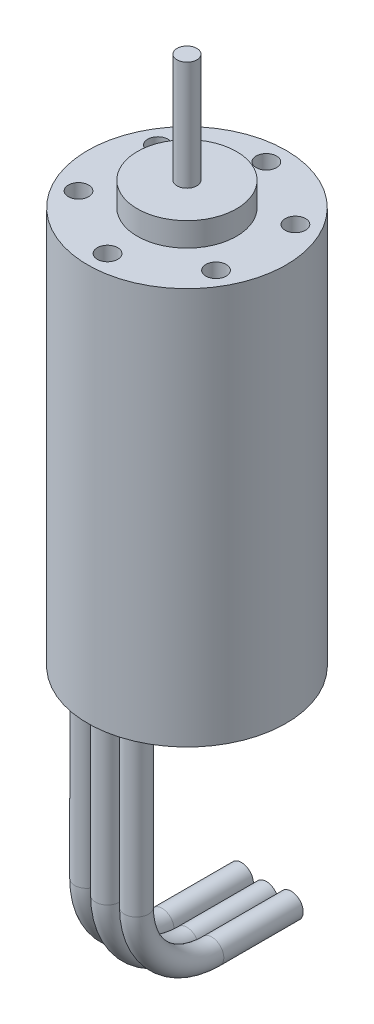
ISO-10303-21;
HEADER;
FILE_DESCRIPTION(('STEP AP214'),'2;1');
FILE_NAME('part.step','',(''),(''),'','','');
FILE_SCHEMA(('AUTOMOTIVE_DESIGN { 1 0 10303 214 1 1 1 1 }'));
ENDSEC;
DATA;
#1=APPLICATION_CONTEXT('core data for automotive mechanical design processes');
#2=APPLICATION_PROTOCOL_DEFINITION('international standard','automotive_design',2000,#1);
#3=PRODUCT_CONTEXT('',#1,'mechanical');
#4=PRODUCT('Part','Part','',(#3));
#5=PRODUCT_RELATED_PRODUCT_CATEGORY('part','',(#4));
#6=PRODUCT_DEFINITION_FORMATION('','',#4);
#7=PRODUCT_DEFINITION_CONTEXT('part definition',#1,'design');
#8=PRODUCT_DEFINITION('design','',#6,#7);
#9=PRODUCT_DEFINITION_SHAPE('','',#8);
#10=(LENGTH_UNIT() NAMED_UNIT(*) SI_UNIT(.MILLI.,.METRE.));
#11=(NAMED_UNIT(*) PLANE_ANGLE_UNIT() SI_UNIT($,.RADIAN.));
#12=(NAMED_UNIT(*) SI_UNIT($,.STERADIAN.) SOLID_ANGLE_UNIT());
#13=UNCERTAINTY_MEASURE_WITH_UNIT(LENGTH_MEASURE(1.E-05),#10,'distance_accuracy_value','');
#14=(GEOMETRIC_REPRESENTATION_CONTEXT(3) GLOBAL_UNCERTAINTY_ASSIGNED_CONTEXT((#13)) GLOBAL_UNIT_ASSIGNED_CONTEXT((#10,
#11,#12)) REPRESENTATION_CONTEXT('',''));
#15=CARTESIAN_POINT('',(0.,0.,0.));
#16=DIRECTION('',(0.,0.,1.));
#17=DIRECTION('',(1.,0.,0.));
#18=AXIS2_PLACEMENT_3D('',#15,#16,#17);
#19=CARTESIAN_POINT('',(0.,55.8,0.));
#20=DIRECTION('',(0.,1.,0.));
#21=DIRECTION('',(0.,0.,1.));
#22=AXIS2_PLACEMENT_3D('',#19,#20,#21);
#23=PLANE('',#22);
#24=CARTESIAN_POINT('',(0.,55.8,0.));
#25=DIRECTION('',(0.,-1.,0.));
#26=DIRECTION('',(0.,0.,-1.));
#27=AXIS2_PLACEMENT_3D('',#24,#25,#26);
#28=CIRCLE('',#27,1.);
#29=CARTESIAN_POINT('',(0.,55.8,-1.));
#30=VERTEX_POINT('',#29);
#31=EDGE_CURVE('E39',#30,#30,#28,.T.);
#32=ORIENTED_EDGE('',*,*,#31,.F.);
#33=EDGE_LOOP('',(#32));
#34=FACE_BOUND('',#33,.T.);
#35=ADVANCED_FACE('F36',(#34),#23,.T.);
#36=CARTESIAN_POINT('',(0.,0.,0.));
#37=DIRECTION('',(0.,-1.,0.));
#38=DIRECTION('',(0.,0.,-1.));
#39=AXIS2_PLACEMENT_3D('',#36,#37,#38);
#40=CYLINDRICAL_SURFACE('',#39,1.);
#41=ORIENTED_EDGE('',*,*,#31,.T.);
#42=EDGE_LOOP('',(#41));
#43=FACE_BOUND('',#42,.T.);
#44=CARTESIAN_POINT('',(0.,44.8,0.));
#45=DIRECTION('',(0.,-1.,0.));
#46=DIRECTION('',(0.,0.,-1.));
#47=AXIS2_PLACEMENT_3D('',#44,#45,#46);
#48=CIRCLE('',#47,1.);
#49=CARTESIAN_POINT('',(0.,44.8,-1.));
#50=VERTEX_POINT('',#49);
#51=EDGE_CURVE('E128',#50,#50,#48,.T.);
#52=ORIENTED_EDGE('',*,*,#51,.F.);
#53=EDGE_LOOP('',(#52));
#54=FACE_BOUND('',#53,.T.);
#55=ADVANCED_FACE('F167',(#43,#54),#40,.T.);
#56=CARTESIAN_POINT('',(1.,44.8,0.));
#57=DIRECTION('',(0.,1.,0.));
#58=DIRECTION('',(0.,0.,1.));
#59=AXIS2_PLACEMENT_3D('',#56,#57,#58);
#60=PLANE('',#59);
#61=ORIENTED_EDGE('',*,*,#51,.T.);
#62=EDGE_LOOP('',(#61));
#63=FACE_BOUND('',#62,.T.);
#64=CARTESIAN_POINT('',(0.,44.8,0.));
#65=DIRECTION('',(0.,-1.,0.));
#66=DIRECTION('',(0.,0.,-1.));
#67=AXIS2_PLACEMENT_3D('',#64,#65,#66);
#68=CIRCLE('',#67,4.99999999999999);
#69=CARTESIAN_POINT('',(0.,44.8,-4.99999999999999));
#70=VERTEX_POINT('',#69);
#71=EDGE_CURVE('E126',#70,#70,#68,.T.);
#72=ORIENTED_EDGE('',*,*,#71,.F.);
#73=EDGE_LOOP('',(#72));
#74=FACE_BOUND('',#73,.T.);
#75=ADVANCED_FACE('F172',(#63,#74),#60,.T.);
#76=CARTESIAN_POINT('',(0.,0.,0.));
#77=DIRECTION('',(0.,-1.,0.));
#78=DIRECTION('',(0.,0.,-1.));
#79=AXIS2_PLACEMENT_3D('',#76,#77,#78);
#80=CYLINDRICAL_SURFACE('',#79,4.99999999999999);
#81=ORIENTED_EDGE('',*,*,#71,.T.);
#82=EDGE_LOOP('',(#81));
#83=FACE_BOUND('',#82,.T.);
#84=CARTESIAN_POINT('',(0.,42.4,0.));
#85=DIRECTION('',(0.,-1.,0.));
#86=DIRECTION('',(0.,0.,-1.));
#87=AXIS2_PLACEMENT_3D('',#84,#85,#86);
#88=CIRCLE('',#87,4.99999999999999);
#89=CARTESIAN_POINT('',(0.,42.4,-4.99999999999999));
#90=VERTEX_POINT('',#89);
#91=EDGE_CURVE('E123',#90,#90,#88,.T.);
#92=ORIENTED_EDGE('',*,*,#91,.F.);
#93=EDGE_LOOP('',(#92));
#94=FACE_BOUND('',#93,.T.);
#95=ADVANCED_FACE('F176',(#83,#94),#80,.T.);
#96=CARTESIAN_POINT('',(4.99999999999999,42.4,0.));
#97=DIRECTION('',(0.,1.,0.));
#98=DIRECTION('',(0.,0.,1.));
#99=AXIS2_PLACEMENT_3D('',#96,#97,#98);
#100=PLANE('',#99);
#101=CARTESIAN_POINT('',(-6.92820323027546,42.4,-4.00000000000008));
#102=DIRECTION('',(0.,1.,0.));
#103=DIRECTION('',(0.,0.,1.));
#104=AXIS2_PLACEMENT_3D('',#101,#102,#103);
#105=CIRCLE('',#104,1.025);
#106=CARTESIAN_POINT('',(-6.92820323027546,42.4,-2.97500000000008));
#107=VERTEX_POINT('',#106);
#108=EDGE_CURVE('E75',#107,#107,#105,.T.);
#109=ORIENTED_EDGE('',*,*,#108,.F.);
#110=EDGE_LOOP('',(#109));
#111=FACE_BOUND('',#110,.T.);
#112=CARTESIAN_POINT('',(-6.92820323027555,42.4,3.99999999999994));
#113=DIRECTION('',(0.,1.,0.));
#114=DIRECTION('',(0.,0.,1.));
#115=AXIS2_PLACEMENT_3D('',#112,#113,#114);
#116=CIRCLE('',#115,1.025);
#117=CARTESIAN_POINT('',(-6.92820323027555,42.4,5.02499999999994));
#118=VERTEX_POINT('',#117);
#119=EDGE_CURVE('E74',#118,#118,#116,.T.);
#120=ORIENTED_EDGE('',*,*,#119,.F.);
#121=EDGE_LOOP('',(#120));
#122=FACE_BOUND('',#121,.T.);
#123=CARTESIAN_POINT('',(0.,42.4,8.));
#124=DIRECTION('',(0.,1.,0.));
#125=DIRECTION('',(0.,0.,1.));
#126=AXIS2_PLACEMENT_3D('',#123,#124,#125);
#127=CIRCLE('',#126,1.025);
#128=CARTESIAN_POINT('',(0.,42.4,9.025));
#129=VERTEX_POINT('',#128);
#130=EDGE_CURVE('E87',#129,#129,#127,.T.);
#131=ORIENTED_EDGE('',*,*,#130,.F.);
#132=EDGE_LOOP('',(#131));
#133=FACE_BOUND('',#132,.T.);
#134=CARTESIAN_POINT('',(6.92820323027549,42.4,4.00000000000003));
#135=DIRECTION('',(0.,1.,0.));
#136=DIRECTION('',(0.,0.,1.));
#137=AXIS2_PLACEMENT_3D('',#134,#135,#136);
#138=CIRCLE('',#137,1.025);
#139=CARTESIAN_POINT('',(6.92820323027549,42.4,5.02500000000003));
#140=VERTEX_POINT('',#139);
#141=EDGE_CURVE('E93',#140,#140,#138,.T.);
#142=ORIENTED_EDGE('',*,*,#141,.F.);
#143=EDGE_LOOP('',(#142));
#144=FACE_BOUND('',#143,.T.);
#145=CARTESIAN_POINT('',(6.92820323027552,42.4,-3.99999999999998));
#146=DIRECTION('',(0.,1.,0.));
#147=DIRECTION('',(0.,0.,1.));
#148=AXIS2_PLACEMENT_3D('',#145,#146,#147);
#149=CIRCLE('',#148,1.025);
#150=CARTESIAN_POINT('',(6.92820323027552,42.4,-2.97499999999999));
#151=VERTEX_POINT('',#150);
#152=EDGE_CURVE('E99',#151,#151,#149,.T.);
#153=ORIENTED_EDGE('',*,*,#152,.F.);
#154=EDGE_LOOP('',(#153));
#155=FACE_BOUND('',#154,.T.);
#156=CARTESIAN_POINT('',(0.,42.4,-8.));
#157=DIRECTION('',(0.,1.,0.));
#158=DIRECTION('',(0.,0.,1.));
#159=AXIS2_PLACEMENT_3D('',#156,#157,#158);
#160=CIRCLE('',#159,1.025);
#161=CARTESIAN_POINT('',(0.,42.4,-6.975));
#162=VERTEX_POINT('',#161);
#163=EDGE_CURVE('E105',#162,#162,#160,.T.);
#164=ORIENTED_EDGE('',*,*,#163,.F.);
#165=EDGE_LOOP('',(#164));
#166=FACE_BOUND('',#165,.T.);
#167=ORIENTED_EDGE('',*,*,#91,.T.);
#168=EDGE_LOOP('',(#167));
#169=FACE_BOUND('',#168,.T.);
#170=CARTESIAN_POINT('',(0.,42.4,0.));
#171=DIRECTION('',(0.,-1.,0.));
#172=DIRECTION('',(0.,0.,-1.));
#173=AXIS2_PLACEMENT_3D('',#170,#171,#172);
#174=CIRCLE('',#173,10.);
#175=CARTESIAN_POINT('',(0.,42.4,-10.));
#176=VERTEX_POINT('',#175);
#177=EDGE_CURVE('E120',#176,#176,#174,.T.);
#178=ORIENTED_EDGE('',*,*,#177,.F.);
#179=EDGE_LOOP('',(#178));
#180=FACE_BOUND('',#179,.T.);
#181=ADVANCED_FACE('F182',(#111,#122,#133,#144,#155,#166,#169,#180),#100,.T.);
#182=CARTESIAN_POINT('',(0.,0.,0.));
#183=DIRECTION('',(0.,-1.,0.));
#184=DIRECTION('',(0.,0.,-1.));
#185=AXIS2_PLACEMENT_3D('',#182,#183,#184);
#186=CYLINDRICAL_SURFACE('',#185,10.);
#187=ORIENTED_EDGE('',*,*,#177,.T.);
#188=EDGE_LOOP('',(#187));
#189=FACE_BOUND('',#188,.T.);
#190=CARTESIAN_POINT('',(0.,2.4,0.));
#191=DIRECTION('',(0.,-1.,0.));
#192=DIRECTION('',(0.,0.,-1.));
#193=AXIS2_PLACEMENT_3D('',#190,#191,#192);
#194=CIRCLE('',#193,10.);
#195=CARTESIAN_POINT('',(0.,2.4,-10.));
#196=VERTEX_POINT('',#195);
#197=EDGE_CURVE('E117',#196,#196,#194,.T.);
#198=ORIENTED_EDGE('',*,*,#197,.F.);
#199=EDGE_LOOP('',(#198));
#200=FACE_BOUND('',#199,.T.);
#201=ADVANCED_FACE('F186',(#189,#200),#186,.T.);
#202=CARTESIAN_POINT('',(5.,2.4,0.));
#203=DIRECTION('',(0.,-1.,0.));
#204=DIRECTION('',(0.,0.,-1.));
#205=AXIS2_PLACEMENT_3D('',#202,#203,#204);
#206=PLANE('',#205);
#207=CARTESIAN_POINT('',(-2.50778978372889,2.4,7.596775));
#208=DIRECTION('',(0.,-1.,0.));
#209=DIRECTION('',(0.,0.,-1.));
#210=AXIS2_PLACEMENT_3D('',#207,#208,#209);
#211=CIRCLE('',#210,1.2065);
#212=CARTESIAN_POINT('',(-2.50778978372889,2.4,6.390275));
#213=VERTEX_POINT('',#212);
#214=EDGE_CURVE('E11',#213,#213,#211,.T.);
#215=ORIENTED_EDGE('',*,*,#214,.F.);
#216=EDGE_LOOP('',(#215));
#217=FACE_BOUND('',#216,.T.);
#218=CARTESIAN_POINT('',(0.,2.4,8.));
#219=DIRECTION('',(0.,-1.,0.));
#220=DIRECTION('',(0.,0.,-1.));
#221=AXIS2_PLACEMENT_3D('',#218,#219,#220);
#222=CIRCLE('',#221,1.2065);
#223=CARTESIAN_POINT('',(0.,2.4,6.7935));
#224=VERTEX_POINT('',#223);
#225=EDGE_CURVE('E44',#224,#224,#222,.T.);
#226=ORIENTED_EDGE('',*,*,#225,.F.);
#227=EDGE_LOOP('',(#226));
#228=FACE_BOUND('',#227,.T.);
#229=CARTESIAN_POINT('',(2.50778978372889,2.4,7.596775));
#230=DIRECTION('',(0.,-1.,0.));
#231=DIRECTION('',(0.,0.,-1.));
#232=AXIS2_PLACEMENT_3D('',#229,#230,#231);
#233=CIRCLE('',#232,1.2065);
#234=CARTESIAN_POINT('',(2.50778978372889,2.4,6.390275));
#235=VERTEX_POINT('',#234);
#236=EDGE_CURVE('E133',#235,#235,#233,.T.);
#237=ORIENTED_EDGE('',*,*,#236,.F.);
#238=EDGE_LOOP('',(#237));
#239=FACE_BOUND('',#238,.T.);
#240=ORIENTED_EDGE('',*,*,#197,.T.);
#241=EDGE_LOOP('',(#240));
#242=FACE_BOUND('',#241,.T.);
#243=CARTESIAN_POINT('',(0.,2.4,0.));
#244=DIRECTION('',(0.,-1.,0.));
#245=DIRECTION('',(0.,0.,-1.));
#246=AXIS2_PLACEMENT_3D('',#243,#244,#245);
#247=CIRCLE('',#246,5.);
#248=CARTESIAN_POINT('',(0.,2.4,-5.));
#249=VERTEX_POINT('',#248);
#250=EDGE_CURVE('E114',#249,#249,#247,.T.);
#251=ORIENTED_EDGE('',*,*,#250,.F.);
#252=EDGE_LOOP('',(#251));
#253=FACE_BOUND('',#252,.T.);
#254=ADVANCED_FACE('F190',(#217,#228,#239,#242,#253),#206,.T.);
#255=CARTESIAN_POINT('',(0.,0.,0.));
#256=DIRECTION('',(0.,-1.,0.));
#257=DIRECTION('',(0.,0.,-1.));
#258=AXIS2_PLACEMENT_3D('',#255,#256,#257);
#259=CYLINDRICAL_SURFACE('',#258,5.);
#260=ORIENTED_EDGE('',*,*,#250,.T.);
#261=EDGE_LOOP('',(#260));
#262=FACE_BOUND('',#261,.T.);
#263=CARTESIAN_POINT('',(0.,0.,0.));
#264=DIRECTION('',(0.,-1.,0.));
#265=DIRECTION('',(0.,0.,-1.));
#266=AXIS2_PLACEMENT_3D('',#263,#264,#265);
#267=CIRCLE('',#266,5.);
#268=CARTESIAN_POINT('',(0.,0.,-5.));
#269=VERTEX_POINT('',#268);
#270=EDGE_CURVE('E111',#269,#269,#267,.T.);
#271=ORIENTED_EDGE('',*,*,#270,.F.);
#272=EDGE_LOOP('',(#271));
#273=FACE_BOUND('',#272,.T.);
#274=ADVANCED_FACE('F194',(#262,#273),#259,.T.);
#275=CARTESIAN_POINT('',(0.,0.,0.));
#276=DIRECTION('',(0.,-1.,0.));
#277=DIRECTION('',(0.,0.,-1.));
#278=AXIS2_PLACEMENT_3D('',#275,#276,#277);
#279=PLANE('',#278);
#280=ORIENTED_EDGE('',*,*,#270,.T.);
#281=EDGE_LOOP('',(#280));
#282=FACE_BOUND('',#281,.T.);
#283=ADVANCED_FACE('F198',(#282),#279,.T.);
#284=CARTESIAN_POINT('',(0.,38.400008,-8.));
#285=DIRECTION('',(0.,1.,0.));
#286=DIRECTION('',(0.,0.,1.));
#287=AXIS2_PLACEMENT_3D('',#284,#285,#286);
#288=CONICAL_SURFACE('',#287,1.025,1.02974425867665);
#289=CARTESIAN_POINT('',(0.,37.7841258654968,-8.));
#290=VERTEX_POINT('',#289);
#291=VERTEX_LOOP('',#290);
#292=FACE_BOUND('',#291,.T.);
#293=CARTESIAN_POINT('',(0.,38.400008,-8.));
#294=DIRECTION('',(0.,1.,0.));
#295=DIRECTION('',(0.,0.,1.));
#296=AXIS2_PLACEMENT_3D('',#293,#294,#295);
#297=CIRCLE('',#296,1.025);
#298=CARTESIAN_POINT('',(0.,38.400008,-6.975));
#299=VERTEX_POINT('',#298);
#300=EDGE_CURVE('E108',#299,#299,#297,.T.);
#301=ORIENTED_EDGE('',*,*,#300,.T.);
#302=EDGE_LOOP('',(#301));
#303=FACE_BOUND('',#302,.T.);
#304=ADVANCED_FACE('F202',(#292,#303),#288,.F.);
#305=CARTESIAN_POINT('',(0.,42.4,-8.));
#306=DIRECTION('',(0.,1.,0.));
#307=DIRECTION('',(0.,0.,1.));
#308=AXIS2_PLACEMENT_3D('',#305,#306,#307);
#309=CYLINDRICAL_SURFACE('',#308,1.025);
#310=ORIENTED_EDGE('',*,*,#300,.F.);
#311=EDGE_LOOP('',(#310));
#312=FACE_BOUND('',#311,.T.);
#313=ORIENTED_EDGE('',*,*,#163,.T.);
#314=EDGE_LOOP('',(#313));
#315=FACE_BOUND('',#314,.T.);
#316=ADVANCED_FACE('F206',(#312,#315),#309,.F.);
#317=CARTESIAN_POINT('',(6.92820323027552,38.400008,-3.99999999999998));
#318=DIRECTION('',(0.,1.,0.));
#319=DIRECTION('',(0.,0.,1.));
#320=AXIS2_PLACEMENT_3D('',#317,#318,#319);
#321=CONICAL_SURFACE('',#320,1.025,1.02974425867666);
#322=CARTESIAN_POINT('',(6.92820323027552,37.7841258654968,-3.99999999999998));
#323=VERTEX_POINT('',#322);
#324=VERTEX_LOOP('',#323);
#325=FACE_BOUND('',#324,.T.);
#326=CARTESIAN_POINT('',(6.92820323027552,38.400008,-3.99999999999998));
#327=DIRECTION('',(0.,1.,0.));
#328=DIRECTION('',(0.,0.,1.));
#329=AXIS2_PLACEMENT_3D('',#326,#327,#328);
#330=CIRCLE('',#329,1.025);
#331=CARTESIAN_POINT('',(6.92820323027552,38.400008,-2.97499999999999));
#332=VERTEX_POINT('',#331);
#333=EDGE_CURVE('E102',#332,#332,#330,.T.);
#334=ORIENTED_EDGE('',*,*,#333,.T.);
#335=EDGE_LOOP('',(#334));
#336=FACE_BOUND('',#335,.T.);
#337=ADVANCED_FACE('F209',(#325,#336),#321,.F.);
#338=CARTESIAN_POINT('',(6.92820323027552,42.4,-3.99999999999998));
#339=DIRECTION('',(0.,1.,0.));
#340=DIRECTION('',(0.,0.,1.));
#341=AXIS2_PLACEMENT_3D('',#338,#339,#340);
#342=CYLINDRICAL_SURFACE('',#341,1.025);
#343=ORIENTED_EDGE('',*,*,#333,.F.);
#344=EDGE_LOOP('',(#343));
#345=FACE_BOUND('',#344,.T.);
#346=ORIENTED_EDGE('',*,*,#152,.T.);
#347=EDGE_LOOP('',(#346));
#348=FACE_BOUND('',#347,.T.);
#349=ADVANCED_FACE('F213',(#345,#348),#342,.F.);
#350=CARTESIAN_POINT('',(6.92820323027549,38.400008,4.00000000000003));
#351=DIRECTION('',(0.,1.,0.));
#352=DIRECTION('',(0.,0.,1.));
#353=AXIS2_PLACEMENT_3D('',#350,#351,#352);
#354=CONICAL_SURFACE('',#353,1.025,1.02974425867665);
#355=CARTESIAN_POINT('',(6.92820323027549,37.7841258654968,4.00000000000003));
#356=VERTEX_POINT('',#355);
#357=VERTEX_LOOP('',#356);
#358=FACE_BOUND('',#357,.T.);
#359=CARTESIAN_POINT('',(6.92820323027549,38.400008,4.00000000000003));
#360=DIRECTION('',(0.,1.,0.));
#361=DIRECTION('',(0.,0.,1.));
#362=AXIS2_PLACEMENT_3D('',#359,#360,#361);
#363=CIRCLE('',#362,1.025);
#364=CARTESIAN_POINT('',(6.92820323027549,38.400008,5.02500000000003));
#365=VERTEX_POINT('',#364);
#366=EDGE_CURVE('E96',#365,#365,#363,.T.);
#367=ORIENTED_EDGE('',*,*,#366,.T.);
#368=EDGE_LOOP('',(#367));
#369=FACE_BOUND('',#368,.T.);
#370=ADVANCED_FACE('F216',(#358,#369),#354,.F.);
#371=CARTESIAN_POINT('',(6.92820323027549,42.4,4.00000000000003));
#372=DIRECTION('',(0.,1.,0.));
#373=DIRECTION('',(0.,0.,1.));
#374=AXIS2_PLACEMENT_3D('',#371,#372,#373);
#375=CYLINDRICAL_SURFACE('',#374,1.025);
#376=ORIENTED_EDGE('',*,*,#366,.F.);
#377=EDGE_LOOP('',(#376));
#378=FACE_BOUND('',#377,.T.);
#379=ORIENTED_EDGE('',*,*,#141,.T.);
#380=EDGE_LOOP('',(#379));
#381=FACE_BOUND('',#380,.T.);
#382=ADVANCED_FACE('F220',(#378,#381),#375,.F.);
#383=CARTESIAN_POINT('',(0.,38.400008,8.));
#384=DIRECTION('',(0.,1.,0.));
#385=DIRECTION('',(0.,0.,1.));
#386=AXIS2_PLACEMENT_3D('',#383,#384,#385);
#387=CONICAL_SURFACE('',#386,1.025,1.02974425867665);
#388=CARTESIAN_POINT('',(0.,37.7841258654968,8.));
#389=VERTEX_POINT('',#388);
#390=VERTEX_LOOP('',#389);
#391=FACE_BOUND('',#390,.T.);
#392=CARTESIAN_POINT('',(0.,38.400008,8.));
#393=DIRECTION('',(0.,1.,0.));
#394=DIRECTION('',(0.,0.,1.));
#395=AXIS2_PLACEMENT_3D('',#392,#393,#394);
#396=CIRCLE('',#395,1.025);
#397=CARTESIAN_POINT('',(0.,38.400008,9.025));
#398=VERTEX_POINT('',#397);
#399=EDGE_CURVE('E90',#398,#398,#396,.T.);
#400=ORIENTED_EDGE('',*,*,#399,.T.);
#401=EDGE_LOOP('',(#400));
#402=FACE_BOUND('',#401,.T.);
#403=ADVANCED_FACE('F224',(#391,#402),#387,.F.);
#404=CARTESIAN_POINT('',(0.,42.4,8.));
#405=DIRECTION('',(0.,1.,0.));
#406=DIRECTION('',(0.,0.,1.));
#407=AXIS2_PLACEMENT_3D('',#404,#405,#406);
#408=CYLINDRICAL_SURFACE('',#407,1.025);
#409=ORIENTED_EDGE('',*,*,#399,.F.);
#410=EDGE_LOOP('',(#409));
#411=FACE_BOUND('',#410,.T.);
#412=ORIENTED_EDGE('',*,*,#130,.T.);
#413=EDGE_LOOP('',(#412));
#414=FACE_BOUND('',#413,.T.);
#415=ADVANCED_FACE('F228',(#411,#414),#408,.F.);
#416=CARTESIAN_POINT('',(-6.92820323027555,38.400008,3.99999999999994));
#417=DIRECTION('',(0.,1.,0.));
#418=DIRECTION('',(0.,0.,1.));
#419=AXIS2_PLACEMENT_3D('',#416,#417,#418);
#420=CONICAL_SURFACE('',#419,1.025,1.02974425867665);
#421=CARTESIAN_POINT('',(-6.92820323027555,37.7841258654968,3.99999999999994));
#422=VERTEX_POINT('',#421);
#423=VERTEX_LOOP('',#422);
#424=FACE_BOUND('',#423,.T.);
#425=CARTESIAN_POINT('',(-6.92820323027555,38.400008,3.99999999999994));
#426=DIRECTION('',(0.,1.,0.));
#427=DIRECTION('',(0.,0.,1.));
#428=AXIS2_PLACEMENT_3D('',#425,#426,#427);
#429=CIRCLE('',#428,1.025);
#430=CARTESIAN_POINT('',(-6.92820323027555,38.400008,5.02499999999993));
#431=VERTEX_POINT('',#430);
#432=EDGE_CURVE('E78',#431,#431,#429,.T.);
#433=ORIENTED_EDGE('',*,*,#432,.T.);
#434=EDGE_LOOP('',(#433));
#435=FACE_BOUND('',#434,.T.);
#436=ADVANCED_FACE('F232',(#424,#435),#420,.F.);
#437=CARTESIAN_POINT('',(-6.92820323027555,42.4,3.99999999999994));
#438=DIRECTION('',(0.,1.,0.));
#439=DIRECTION('',(0.,0.,1.));
#440=AXIS2_PLACEMENT_3D('',#437,#438,#439);
#441=CYLINDRICAL_SURFACE('',#440,1.025);
#442=ORIENTED_EDGE('',*,*,#432,.F.);
#443=EDGE_LOOP('',(#442));
#444=FACE_BOUND('',#443,.T.);
#445=ORIENTED_EDGE('',*,*,#119,.T.);
#446=EDGE_LOOP('',(#445));
#447=FACE_BOUND('',#446,.T.);
#448=ADVANCED_FACE('F68',(#444,#447),#441,.F.);
#449=CARTESIAN_POINT('',(-6.92820323027546,38.400008,-4.00000000000008));
#450=DIRECTION('',(0.,1.,0.));
#451=DIRECTION('',(0.,0.,1.));
#452=AXIS2_PLACEMENT_3D('',#449,#450,#451);
#453=CONICAL_SURFACE('',#452,1.025,1.02974425867665);
#454=CARTESIAN_POINT('',(-6.92820323027546,37.7841258654968,-4.00000000000008));
#455=VERTEX_POINT('',#454);
#456=VERTEX_LOOP('',#455);
#457=FACE_BOUND('',#456,.T.);
#458=CARTESIAN_POINT('',(-6.92820323027546,38.400008,-4.00000000000008));
#459=DIRECTION('',(0.,1.,0.));
#460=DIRECTION('',(0.,0.,1.));
#461=AXIS2_PLACEMENT_3D('',#458,#459,#460);
#462=CIRCLE('',#461,1.025);
#463=CARTESIAN_POINT('',(-6.92820323027546,38.400008,-2.97500000000008));
#464=VERTEX_POINT('',#463);
#465=EDGE_CURVE('E72',#464,#464,#462,.T.);
#466=ORIENTED_EDGE('',*,*,#465,.T.);
#467=EDGE_LOOP('',(#466));
#468=FACE_BOUND('',#467,.T.);
#469=ADVANCED_FACE('F64',(#457,#468),#453,.F.);
#470=CARTESIAN_POINT('',(-6.92820323027546,42.4,-4.00000000000008));
#471=DIRECTION('',(0.,1.,0.));
#472=DIRECTION('',(0.,0.,1.));
#473=AXIS2_PLACEMENT_3D('',#470,#471,#472);
#474=CYLINDRICAL_SURFACE('',#473,1.025);
#475=ORIENTED_EDGE('',*,*,#465,.F.);
#476=EDGE_LOOP('',(#475));
#477=FACE_BOUND('',#476,.T.);
#478=ORIENTED_EDGE('',*,*,#108,.T.);
#479=EDGE_LOOP('',(#478));
#480=FACE_BOUND('',#479,.T.);
#481=ADVANCED_FACE('F67',(#477,#480),#474,.F.);
#482=CARTESIAN_POINT('',(2.50778978372889,-21.196775,0.));
#483=DIRECTION('',(0.,0.,-1.));
#484=DIRECTION('',(-1.,0.,0.));
#485=AXIS2_PLACEMENT_3D('',#482,#483,#484);
#486=CYLINDRICAL_SURFACE('',#485,1.2065);
#487=CARTESIAN_POINT('',(2.50778978372889,-21.196775,0.));
#488=DIRECTION('',(0.,0.,-1.));
#489=DIRECTION('',(0.,1.,0.));
#490=AXIS2_PLACEMENT_3D('',#487,#488,#489);
#491=CIRCLE('',#490,1.2065);
#492=CARTESIAN_POINT('',(2.50778978372889,-22.403275,0.));
#493=VERTEX_POINT('',#492);
#494=EDGE_CURVE('E146',#493,#493,#491,.T.);
#495=ORIENTED_EDGE('',*,*,#494,.T.);
#496=EDGE_LOOP('',(#495));
#497=FACE_BOUND('',#496,.T.);
#498=CARTESIAN_POINT('',(2.50778978372889,-21.196775,-8.00000000000001));
#499=DIRECTION('',(0.,0.,-1.));
#500=DIRECTION('',(0.,1.,0.));
#501=AXIS2_PLACEMENT_3D('',#498,#499,#500);
#502=CIRCLE('',#501,1.2065);
#503=CARTESIAN_POINT('',(2.50778978372889,-19.990275,-8.00000000000001));
#504=VERTEX_POINT('',#503);
#505=EDGE_CURVE('E81',#504,#504,#502,.T.);
#506=ORIENTED_EDGE('',*,*,#505,.F.);
#507=EDGE_LOOP('',(#506));
#508=FACE_BOUND('',#507,.T.);
#509=ADVANCED_FACE('F153',(#497,#508),#486,.T.);
#510=CARTESIAN_POINT('',(2.50778978372889,-13.6,0.));
#511=DIRECTION('',(1.,0.,0.));
#512=DIRECTION('',(0.,0.,-1.));
#513=AXIS2_PLACEMENT_3D('',#510,#511,#512);
#514=TOROIDAL_SURFACE('',#513,7.596775,1.2065);
#515=CARTESIAN_POINT('',(2.50778978372889,-13.6,7.596775));
#516=DIRECTION('',(0.,-1.,0.));
#517=DIRECTION('',(0.,0.,-1.));
#518=AXIS2_PLACEMENT_3D('',#515,#516,#517);
#519=CIRCLE('',#518,1.2065);
#520=CARTESIAN_POINT('',(2.50778978372889,-13.6,8.803275));
#521=VERTEX_POINT('',#520);
#522=EDGE_CURVE('E144',#521,#521,#519,.T.);
#523=CARTESIAN_POINT('',(2.50778978372889,-13.6,0.));
#524=DIRECTION('',(1.,0.,0.));
#525=DIRECTION('',(0.,0.,-1.));
#526=AXIS2_PLACEMENT_3D('',#523,#524,#525);
#527=CIRCLE('',#526,8.803275);
#528=EDGE_CURVE('',#521,#493,#527,.T.);
#529=ORIENTED_EDGE('',*,*,#522,.T.);
#530=ORIENTED_EDGE('',*,*,#494,.F.);
#531=ORIENTED_EDGE('',*,*,#528,.T.);
#532=ORIENTED_EDGE('',*,*,#528,.F.);
#533=EDGE_LOOP('',(#529,#531,#530,#532));
#534=FACE_BOUND('',#533,.T.);
#535=ADVANCED_FACE('F155',(#534),#514,.T.);
#536=CARTESIAN_POINT('',(2.50778978372889,-13.6,7.596775));
#537=DIRECTION('',(0.,1.,0.));
#538=DIRECTION('',(0.,0.,1.));
#539=AXIS2_PLACEMENT_3D('',#536,#537,#538);
#540=CYLINDRICAL_SURFACE('',#539,1.2065);
#541=ORIENTED_EDGE('',*,*,#522,.F.);
#542=EDGE_LOOP('',(#541));
#543=FACE_BOUND('',#542,.T.);
#544=ORIENTED_EDGE('',*,*,#236,.T.);
#545=EDGE_LOOP('',(#544));
#546=FACE_BOUND('',#545,.T.);
#547=ADVANCED_FACE('F162',(#543,#546),#540,.T.);
#548=CARTESIAN_POINT('',(2.50778978372889,-21.196775,-8.00000000000001));
#549=DIRECTION('',(0.,0.,-1.));
#550=DIRECTION('',(0.,1.,0.));
#551=AXIS2_PLACEMENT_3D('',#548,#549,#550);
#552=PLANE('',#551);
#553=ORIENTED_EDGE('',*,*,#505,.T.);
#554=EDGE_LOOP('',(#553));
#555=FACE_BOUND('',#554,.T.);
#556=ADVANCED_FACE('F151',(#555),#552,.T.);
#557=CARTESIAN_POINT('',(0.,-21.6,0.));
#558=DIRECTION('',(0.,0.,-1.));
#559=DIRECTION('',(-1.,0.,0.));
#560=AXIS2_PLACEMENT_3D('',#557,#558,#559);
#561=CYLINDRICAL_SURFACE('',#560,1.2065);
#562=CARTESIAN_POINT('',(0.,-21.6,0.));
#563=DIRECTION('',(0.,0.,-1.));
#564=DIRECTION('',(0.,1.,0.));
#565=AXIS2_PLACEMENT_3D('',#562,#563,#564);
#566=CIRCLE('',#565,1.2065);
#567=CARTESIAN_POINT('',(0.,-22.8065,0.));
#568=VERTEX_POINT('',#567);
#569=EDGE_CURVE('E553',#568,#568,#566,.T.);
#570=ORIENTED_EDGE('',*,*,#569,.T.);
#571=EDGE_LOOP('',(#570));
#572=FACE_BOUND('',#571,.T.);
#573=CARTESIAN_POINT('',(0.,-21.6,-8.00000000000001));
#574=DIRECTION('',(0.,0.,-1.));
#575=DIRECTION('',(0.,1.,0.));
#576=AXIS2_PLACEMENT_3D('',#573,#574,#575);
#577=CIRCLE('',#576,1.2065);
#578=CARTESIAN_POINT('',(0.,-20.3935,-8.00000000000001));
#579=VERTEX_POINT('',#578);
#580=EDGE_CURVE('E551',#579,#579,#577,.T.);
#581=ORIENTED_EDGE('',*,*,#580,.F.);
#582=EDGE_LOOP('',(#581));
#583=FACE_BOUND('',#582,.T.);
#584=ADVANCED_FACE('F391',(#572,#583),#561,.T.);
#585=CARTESIAN_POINT('',(0.,-13.6,0.));
#586=DIRECTION('',(1.,0.,0.));
#587=DIRECTION('',(0.,0.,-1.));
#588=AXIS2_PLACEMENT_3D('',#585,#586,#587);
#589=TOROIDAL_SURFACE('',#588,8.,1.2065);
#590=CARTESIAN_POINT('',(0.,-13.6,8.));
#591=DIRECTION('',(0.,-1.,0.));
#592=DIRECTION('',(0.,0.,-1.));
#593=AXIS2_PLACEMENT_3D('',#590,#591,#592);
#594=CIRCLE('',#593,1.2065);
#595=CARTESIAN_POINT('',(0.,-13.6,9.2065));
#596=VERTEX_POINT('',#595);
#597=EDGE_CURVE('E556',#596,#596,#594,.T.);
#598=CARTESIAN_POINT('',(0.,-13.6,0.));
#599=DIRECTION('',(1.,0.,0.));
#600=DIRECTION('',(0.,0.,-1.));
#601=AXIS2_PLACEMENT_3D('',#598,#599,#600);
#602=CIRCLE('',#601,9.2065);
#603=EDGE_CURVE('',#596,#568,#602,.T.);
#604=ORIENTED_EDGE('',*,*,#597,.T.);
#605=ORIENTED_EDGE('',*,*,#569,.F.);
#606=ORIENTED_EDGE('',*,*,#603,.T.);
#607=ORIENTED_EDGE('',*,*,#603,.F.);
#608=EDGE_LOOP('',(#604,#606,#605,#607));
#609=FACE_BOUND('',#608,.T.);
#610=ADVANCED_FACE('F346',(#609),#589,.T.);
#611=CARTESIAN_POINT('',(0.,-13.6,8.));
#612=DIRECTION('',(0.,1.,0.));
#613=DIRECTION('',(0.,0.,1.));
#614=AXIS2_PLACEMENT_3D('',#611,#612,#613);
#615=CYLINDRICAL_SURFACE('',#614,1.2065);
#616=ORIENTED_EDGE('',*,*,#597,.F.);
#617=EDGE_LOOP('',(#616));
#618=FACE_BOUND('',#617,.T.);
#619=ORIENTED_EDGE('',*,*,#225,.T.);
#620=EDGE_LOOP('',(#619));
#621=FACE_BOUND('',#620,.T.);
#622=ADVANCED_FACE('F340',(#618,#621),#615,.T.);
#623=CARTESIAN_POINT('',(0.,-21.6,-8.00000000000001));
#624=DIRECTION('',(0.,0.,-1.));
#625=DIRECTION('',(0.,1.,0.));
#626=AXIS2_PLACEMENT_3D('',#623,#624,#625);
#627=PLANE('',#626);
#628=ORIENTED_EDGE('',*,*,#580,.T.);
#629=EDGE_LOOP('',(#628));
#630=FACE_BOUND('',#629,.T.);
#631=ADVANCED_FACE('F345',(#630),#627,.T.);
#632=CARTESIAN_POINT('',(-2.50778978372889,-21.196775,0.));
#633=DIRECTION('',(0.,0.,-1.));
#634=DIRECTION('',(-1.,0.,0.));
#635=AXIS2_PLACEMENT_3D('',#632,#633,#634);
#636=CYLINDRICAL_SURFACE('',#635,1.2065);
#637=CARTESIAN_POINT('',(-2.50778978372889,-21.196775,0.));
#638=DIRECTION('',(0.,0.,-1.));
#639=DIRECTION('',(0.,1.,0.));
#640=AXIS2_PLACEMENT_3D('',#637,#638,#639);
#641=CIRCLE('',#640,1.2065);
#642=CARTESIAN_POINT('',(-2.50778978372889,-22.403275,0.));
#643=VERTEX_POINT('',#642);
#644=EDGE_CURVE('E564',#643,#643,#641,.T.);
#645=ORIENTED_EDGE('',*,*,#644,.T.);
#646=EDGE_LOOP('',(#645));
#647=FACE_BOUND('',#646,.T.);
#648=CARTESIAN_POINT('',(-2.50778978372889,-21.196775,-8.00000000000001));
#649=DIRECTION('',(0.,0.,-1.));
#650=DIRECTION('',(0.,1.,0.));
#651=AXIS2_PLACEMENT_3D('',#648,#649,#650);
#652=CIRCLE('',#651,1.2065);
#653=CARTESIAN_POINT('',(-2.50778978372889,-19.990275,-8.00000000000001));
#654=VERTEX_POINT('',#653);
#655=EDGE_CURVE('E561',#654,#654,#652,.T.);
#656=ORIENTED_EDGE('',*,*,#655,.F.);
#657=EDGE_LOOP('',(#656));
#658=FACE_BOUND('',#657,.T.);
#659=ADVANCED_FACE('F374',(#647,#658),#636,.T.);
#660=CARTESIAN_POINT('',(-2.50778978372889,-13.6,0.));
#661=DIRECTION('',(1.,0.,0.));
#662=DIRECTION('',(0.,0.,-1.));
#663=AXIS2_PLACEMENT_3D('',#660,#661,#662);
#664=TOROIDAL_SURFACE('',#663,7.596775,1.2065);
#665=CARTESIAN_POINT('',(-2.50778978372889,-13.6,7.596775));
#666=DIRECTION('',(0.,-1.,0.));
#667=DIRECTION('',(0.,0.,-1.));
#668=AXIS2_PLACEMENT_3D('',#665,#666,#667);
#669=CIRCLE('',#668,1.2065);
#670=CARTESIAN_POINT('',(-2.50778978372889,-13.6,8.803275));
#671=VERTEX_POINT('',#670);
#672=EDGE_CURVE('E566',#671,#671,#669,.T.);
#673=CARTESIAN_POINT('',(-2.50778978372889,-13.6,0.));
#674=DIRECTION('',(1.,0.,0.));
#675=DIRECTION('',(0.,0.,-1.));
#676=AXIS2_PLACEMENT_3D('',#673,#674,#675);
#677=CIRCLE('',#676,8.803275);
#678=EDGE_CURVE('',#671,#643,#677,.T.);
#679=ORIENTED_EDGE('',*,*,#672,.T.);
#680=ORIENTED_EDGE('',*,*,#644,.F.);
#681=ORIENTED_EDGE('',*,*,#678,.T.);
#682=ORIENTED_EDGE('',*,*,#678,.F.);
#683=EDGE_LOOP('',(#679,#681,#680,#682));
#684=FACE_BOUND('',#683,.T.);
#685=ADVANCED_FACE('F362',(#684),#664,.T.);
#686=CARTESIAN_POINT('',(-2.50778978372889,-13.6,7.596775));
#687=DIRECTION('',(0.,1.,0.));
#688=DIRECTION('',(0.,0.,1.));
#689=AXIS2_PLACEMENT_3D('',#686,#687,#688);
#690=CYLINDRICAL_SURFACE('',#689,1.2065);
#691=ORIENTED_EDGE('',*,*,#672,.F.);
#692=EDGE_LOOP('',(#691));
#693=FACE_BOUND('',#692,.T.);
#694=ORIENTED_EDGE('',*,*,#214,.T.);
#695=EDGE_LOOP('',(#694));
#696=FACE_BOUND('',#695,.T.);
#697=ADVANCED_FACE('F356',(#693,#696),#690,.T.);
#698=CARTESIAN_POINT('',(-2.50778978372889,-21.196775,-8.00000000000001));
#699=DIRECTION('',(0.,0.,-1.));
#700=DIRECTION('',(0.,1.,0.));
#701=AXIS2_PLACEMENT_3D('',#698,#699,#700);
#702=PLANE('',#701);
#703=ORIENTED_EDGE('',*,*,#655,.T.);
#704=EDGE_LOOP('',(#703));
#705=FACE_BOUND('',#704,.T.);
#706=ADVANCED_FACE('F361',(#705),#702,.T.);
#707=CLOSED_SHELL('',(#35,#55,#75,#95,#181,#201,#254,#274,#283,#304,#316,#337,#349,#370,#382,
#403,#415,#436,#448,#469,#481,#509,#535,#547,#556,#584,#610,#622,#631,#659,#685,#697,#706));
#708=MANIFOLD_SOLID_BREP('B2',#707);
#709=ADVANCED_BREP_SHAPE_REPRESENTATION('',(#18,#708),#14);
#710=SHAPE_DEFINITION_REPRESENTATION(#9,#709);
ENDSEC;
END-ISO-10303-21;
